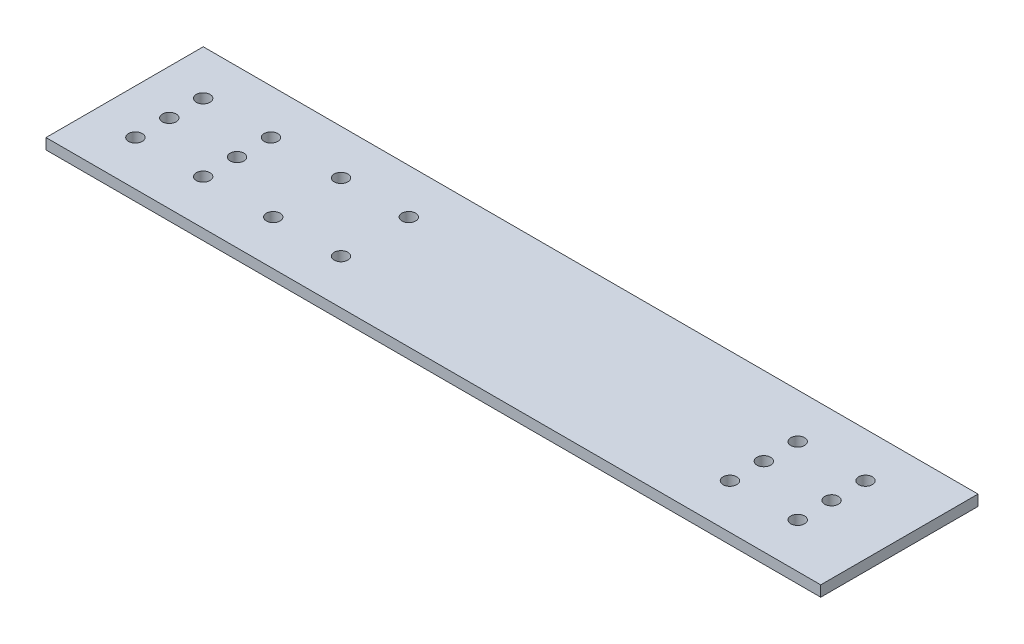
ISO-10303-21;
HEADER;
FILE_DESCRIPTION(('STEP AP214'),'2;1');
FILE_NAME('part.step','',(''),(''),'','','');
FILE_SCHEMA(('AUTOMOTIVE_DESIGN { 1 0 10303 214 1 1 1 1 }'));
ENDSEC;
DATA;
#1=APPLICATION_CONTEXT('core data for automotive mechanical design processes');
#2=APPLICATION_PROTOCOL_DEFINITION('international standard','automotive_design',2000,#1);
#3=PRODUCT_CONTEXT('',#1,'mechanical');
#4=PRODUCT('Part','Part','',(#3));
#5=PRODUCT_RELATED_PRODUCT_CATEGORY('part','',(#4));
#6=PRODUCT_DEFINITION_FORMATION('','',#4);
#7=PRODUCT_DEFINITION_CONTEXT('part definition',#1,'design');
#8=PRODUCT_DEFINITION('design','',#6,#7);
#9=PRODUCT_DEFINITION_SHAPE('','',#8);
#10=(LENGTH_UNIT() NAMED_UNIT(*) SI_UNIT(.MILLI.,.METRE.));
#11=(NAMED_UNIT(*) PLANE_ANGLE_UNIT() SI_UNIT($,.RADIAN.));
#12=(NAMED_UNIT(*) SI_UNIT($,.STERADIAN.) SOLID_ANGLE_UNIT());
#13=UNCERTAINTY_MEASURE_WITH_UNIT(LENGTH_MEASURE(1.E-05),#10,'distance_accuracy_value','');
#14=(GEOMETRIC_REPRESENTATION_CONTEXT(3) GLOBAL_UNCERTAINTY_ASSIGNED_CONTEXT((#13)) GLOBAL_UNIT_ASSIGNED_CONTEXT((#10,
#11,#12)) REPRESENTATION_CONTEXT('',''));
#15=CARTESIAN_POINT('',(0.,0.,0.));
#16=DIRECTION('',(0.,0.,1.));
#17=DIRECTION('',(1.,0.,0.));
#18=AXIS2_PLACEMENT_3D('',#15,#16,#17);
#19=CARTESIAN_POINT('',(0.,6.35,0.));
#20=DIRECTION('',(0.,-1.,0.));
#21=DIRECTION('',(0.,0.,-1.));
#22=AXIS2_PLACEMENT_3D('',#19,#20,#21);
#23=PLANE('',#22);
#24=DIRECTION('',(0.,0.,1.));
#25=VECTOR('',#24,1.);
#26=CARTESIAN_POINT('',(-46.35,6.35,-46.4));
#27=LINE('',#26,#25);
#28=CARTESIAN_POINT('',(-46.35,6.35,-46.4));
#29=VERTEX_POINT('',#28);
#30=CARTESIAN_POINT('',(-46.35,6.35,46.4));
#31=VERTEX_POINT('',#30);
#32=EDGE_CURVE('E85',#29,#31,#27,.T.);
#33=ORIENTED_EDGE('',*,*,#32,.T.);
#34=DIRECTION('',(1.,0.,0.));
#35=VECTOR('',#34,1.);
#36=CARTESIAN_POINT('',(410.85,6.35,46.3999999999999));
#37=LINE('',#36,#35);
#38=CARTESIAN_POINT('',(410.85,6.35,46.3999999999999));
#39=VERTEX_POINT('',#38);
#40=EDGE_CURVE('E80',#31,#39,#37,.T.);
#41=ORIENTED_EDGE('',*,*,#40,.T.);
#42=DIRECTION('',(0.,0.,-1.));
#43=VECTOR('',#42,1.);
#44=CARTESIAN_POINT('',(410.85,6.35,-46.4));
#45=LINE('',#44,#43);
#46=CARTESIAN_POINT('',(410.85,6.35,-46.4));
#47=VERTEX_POINT('',#46);
#48=EDGE_CURVE('E83',#39,#47,#45,.T.);
#49=ORIENTED_EDGE('',*,*,#48,.T.);
#50=DIRECTION('',(-1.,0.,0.));
#51=VECTOR('',#50,1.);
#52=CARTESIAN_POINT('',(-46.35,6.35,-46.4));
#53=LINE('',#52,#51);
#54=EDGE_CURVE('E50',#47,#29,#53,.T.);
#55=ORIENTED_EDGE('',*,*,#54,.T.);
#56=EDGE_LOOP('',(#33,#41,#49,#55));
#57=FACE_BOUND('',#56,.T.);
#58=CARTESIAN_POINT('',(-20.,6.35,-20.));
#59=DIRECTION('',(0.,1.,0.));
#60=DIRECTION('',(0.,0.,1.));
#61=AXIS2_PLACEMENT_3D('',#58,#59,#60);
#62=CIRCLE('',#61,4.05);
#63=CARTESIAN_POINT('',(-20.,6.35,-15.95));
#64=VERTEX_POINT('',#63);
#65=EDGE_CURVE('E100',#64,#64,#62,.T.);
#66=ORIENTED_EDGE('',*,*,#65,.F.);
#67=EDGE_LOOP('',(#66));
#68=FACE_BOUND('',#67,.T.);
#69=CARTESIAN_POINT('',(20.,6.35,-20.));
#70=DIRECTION('',(0.,1.,0.));
#71=DIRECTION('',(0.,0.,1.));
#72=AXIS2_PLACEMENT_3D('',#69,#70,#71);
#73=CIRCLE('',#72,4.05);
#74=CARTESIAN_POINT('',(20.,6.35,-15.95));
#75=VERTEX_POINT('',#74);
#76=EDGE_CURVE('E115',#75,#75,#73,.T.);
#77=ORIENTED_EDGE('',*,*,#76,.F.);
#78=EDGE_LOOP('',(#77));
#79=FACE_BOUND('',#78,.T.);
#80=CARTESIAN_POINT('',(20.,6.35,20.));
#81=DIRECTION('',(0.,1.,0.));
#82=DIRECTION('',(0.,0.,1.));
#83=AXIS2_PLACEMENT_3D('',#80,#81,#82);
#84=CIRCLE('',#83,4.05);
#85=CARTESIAN_POINT('',(20.,6.35,24.05));
#86=VERTEX_POINT('',#85);
#87=EDGE_CURVE('E121',#86,#86,#84,.T.);
#88=ORIENTED_EDGE('',*,*,#87,.F.);
#89=EDGE_LOOP('',(#88));
#90=FACE_BOUND('',#89,.T.);
#91=CARTESIAN_POINT('',(-20.,6.35,20.));
#92=DIRECTION('',(0.,1.,0.));
#93=DIRECTION('',(0.,0.,1.));
#94=AXIS2_PLACEMENT_3D('',#91,#92,#93);
#95=CIRCLE('',#94,4.05);
#96=CARTESIAN_POINT('',(-20.,6.35,24.05));
#97=VERTEX_POINT('',#96);
#98=EDGE_CURVE('E127',#97,#97,#95,.T.);
#99=ORIENTED_EDGE('',*,*,#98,.F.);
#100=EDGE_LOOP('',(#99));
#101=FACE_BOUND('',#100,.T.);
#102=CARTESIAN_POINT('',(-20.,6.35,0.));
#103=DIRECTION('',(0.,1.,0.));
#104=DIRECTION('',(0.,0.,1.));
#105=AXIS2_PLACEMENT_3D('',#102,#103,#104);
#106=CIRCLE('',#105,4.05);
#107=CARTESIAN_POINT('',(-20.,6.35,4.05));
#108=VERTEX_POINT('',#107);
#109=EDGE_CURVE('E133',#108,#108,#106,.T.);
#110=ORIENTED_EDGE('',*,*,#109,.F.);
#111=EDGE_LOOP('',(#110));
#112=FACE_BOUND('',#111,.T.);
#113=CARTESIAN_POINT('',(20.,6.35,0.));
#114=DIRECTION('',(0.,1.,0.));
#115=DIRECTION('',(0.,0.,1.));
#116=AXIS2_PLACEMENT_3D('',#113,#114,#115);
#117=CIRCLE('',#116,4.05);
#118=CARTESIAN_POINT('',(20.,6.35,4.05));
#119=VERTEX_POINT('',#118);
#120=EDGE_CURVE('E139',#119,#119,#117,.T.);
#121=ORIENTED_EDGE('',*,*,#120,.F.);
#122=EDGE_LOOP('',(#121));
#123=FACE_BOUND('',#122,.T.);
#124=CARTESIAN_POINT('',(330.85,6.35,-20.));
#125=DIRECTION('',(0.,1.,0.));
#126=DIRECTION('',(0.,0.,1.));
#127=AXIS2_PLACEMENT_3D('',#124,#125,#126);
#128=CIRCLE('',#127,4.05000000000002);
#129=CARTESIAN_POINT('',(330.85,6.35,-15.95));
#130=VERTEX_POINT('',#129);
#131=EDGE_CURVE('E145',#130,#130,#128,.T.);
#132=ORIENTED_EDGE('',*,*,#131,.F.);
#133=EDGE_LOOP('',(#132));
#134=FACE_BOUND('',#133,.T.);
#135=CARTESIAN_POINT('',(370.85,6.35,-20.));
#136=DIRECTION('',(0.,1.,0.));
#137=DIRECTION('',(0.,0.,1.));
#138=AXIS2_PLACEMENT_3D('',#135,#136,#137);
#139=CIRCLE('',#138,4.05000000000002);
#140=CARTESIAN_POINT('',(370.85,6.35,-15.95));
#141=VERTEX_POINT('',#140);
#142=EDGE_CURVE('E151',#141,#141,#139,.T.);
#143=ORIENTED_EDGE('',*,*,#142,.F.);
#144=EDGE_LOOP('',(#143));
#145=FACE_BOUND('',#144,.T.);
#146=CARTESIAN_POINT('',(370.85,6.35,20.));
#147=DIRECTION('',(0.,1.,0.));
#148=DIRECTION('',(0.,0.,1.));
#149=AXIS2_PLACEMENT_3D('',#146,#147,#148);
#150=CIRCLE('',#149,4.05000000000002);
#151=CARTESIAN_POINT('',(370.85,6.35,24.05));
#152=VERTEX_POINT('',#151);
#153=EDGE_CURVE('E157',#152,#152,#150,.T.);
#154=ORIENTED_EDGE('',*,*,#153,.F.);
#155=EDGE_LOOP('',(#154));
#156=FACE_BOUND('',#155,.T.);
#157=CARTESIAN_POINT('',(330.85,6.35,20.));
#158=DIRECTION('',(0.,1.,0.));
#159=DIRECTION('',(0.,0.,1.));
#160=AXIS2_PLACEMENT_3D('',#157,#158,#159);
#161=CIRCLE('',#160,4.05000000000002);
#162=CARTESIAN_POINT('',(330.85,6.35,24.05));
#163=VERTEX_POINT('',#162);
#164=EDGE_CURVE('E163',#163,#163,#161,.T.);
#165=ORIENTED_EDGE('',*,*,#164,.F.);
#166=EDGE_LOOP('',(#165));
#167=FACE_BOUND('',#166,.T.);
#168=CARTESIAN_POINT('',(61.35,6.35,-20.));
#169=DIRECTION('',(0.,1.,0.));
#170=DIRECTION('',(0.,0.,1.));
#171=AXIS2_PLACEMENT_3D('',#168,#169,#170);
#172=CIRCLE('',#171,4.05);
#173=CARTESIAN_POINT('',(61.35,6.35,-15.95));
#174=VERTEX_POINT('',#173);
#175=EDGE_CURVE('E169',#174,#174,#172,.T.);
#176=ORIENTED_EDGE('',*,*,#175,.F.);
#177=EDGE_LOOP('',(#176));
#178=FACE_BOUND('',#177,.T.);
#179=CARTESIAN_POINT('',(101.35,6.35,-20.));
#180=DIRECTION('',(0.,1.,0.));
#181=DIRECTION('',(0.,0.,1.));
#182=AXIS2_PLACEMENT_3D('',#179,#180,#181);
#183=CIRCLE('',#182,4.04999999999999);
#184=CARTESIAN_POINT('',(101.35,6.35,-15.95));
#185=VERTEX_POINT('',#184);
#186=EDGE_CURVE('E175',#185,#185,#183,.T.);
#187=ORIENTED_EDGE('',*,*,#186,.F.);
#188=EDGE_LOOP('',(#187));
#189=FACE_BOUND('',#188,.T.);
#190=CARTESIAN_POINT('',(330.85,6.35,0.));
#191=DIRECTION('',(0.,1.,0.));
#192=DIRECTION('',(0.,0.,1.));
#193=AXIS2_PLACEMENT_3D('',#190,#191,#192);
#194=CIRCLE('',#193,4.05000000000002);
#195=CARTESIAN_POINT('',(330.85,6.35,4.05000000000004));
#196=VERTEX_POINT('',#195);
#197=EDGE_CURVE('E181',#196,#196,#194,.T.);
#198=ORIENTED_EDGE('',*,*,#197,.F.);
#199=EDGE_LOOP('',(#198));
#200=FACE_BOUND('',#199,.T.);
#201=CARTESIAN_POINT('',(370.85,6.35,0.));
#202=DIRECTION('',(0.,1.,0.));
#203=DIRECTION('',(0.,0.,1.));
#204=AXIS2_PLACEMENT_3D('',#201,#202,#203);
#205=CIRCLE('',#204,4.05000000000002);
#206=CARTESIAN_POINT('',(370.85,6.35,4.05000000000004));
#207=VERTEX_POINT('',#206);
#208=EDGE_CURVE('E187',#207,#207,#205,.T.);
#209=ORIENTED_EDGE('',*,*,#208,.F.);
#210=EDGE_LOOP('',(#209));
#211=FACE_BOUND('',#210,.T.);
#212=CARTESIAN_POINT('',(101.35,6.35,20.));
#213=DIRECTION('',(0.,1.,0.));
#214=DIRECTION('',(0.,0.,1.));
#215=AXIS2_PLACEMENT_3D('',#212,#213,#214);
#216=CIRCLE('',#215,4.04999999999999);
#217=CARTESIAN_POINT('',(101.35,6.35,24.05));
#218=VERTEX_POINT('',#217);
#219=EDGE_CURVE('E193',#218,#218,#216,.T.);
#220=ORIENTED_EDGE('',*,*,#219,.F.);
#221=EDGE_LOOP('',(#220));
#222=FACE_BOUND('',#221,.T.);
#223=CARTESIAN_POINT('',(61.35,6.35,20.));
#224=DIRECTION('',(0.,1.,0.));
#225=DIRECTION('',(0.,0.,1.));
#226=AXIS2_PLACEMENT_3D('',#223,#224,#225);
#227=CIRCLE('',#226,4.05);
#228=CARTESIAN_POINT('',(61.35,6.35,24.05));
#229=VERTEX_POINT('',#228);
#230=EDGE_CURVE('E199',#229,#229,#227,.T.);
#231=ORIENTED_EDGE('',*,*,#230,.F.);
#232=EDGE_LOOP('',(#231));
#233=FACE_BOUND('',#232,.T.);
#234=ADVANCED_FACE('F33',(#57,#68,#79,#90,#101,#112,#123,#134,#145,#156,#167,#178,#189,#200,
#211,#222,#233),#23,.F.);
#235=CARTESIAN_POINT('',(0.,0.,0.));
#236=DIRECTION('',(0.,-1.,0.));
#237=DIRECTION('',(0.,0.,-1.));
#238=AXIS2_PLACEMENT_3D('',#235,#236,#237);
#239=PLANE('',#238);
#240=CARTESIAN_POINT('',(101.35,0.,20.));
#241=DIRECTION('',(0.,1.,0.));
#242=DIRECTION('',(0.,0.,1.));
#243=AXIS2_PLACEMENT_3D('',#240,#241,#242);
#244=CIRCLE('',#243,4.04999999999999);
#245=CARTESIAN_POINT('',(101.35,0.,24.05));
#246=VERTEX_POINT('',#245);
#247=EDGE_CURVE('E196',#246,#246,#244,.T.);
#248=ORIENTED_EDGE('',*,*,#247,.T.);
#249=EDGE_LOOP('',(#248));
#250=FACE_BOUND('',#249,.T.);
#251=CARTESIAN_POINT('',(330.85,0.,0.));
#252=DIRECTION('',(0.,1.,0.));
#253=DIRECTION('',(0.,0.,1.));
#254=AXIS2_PLACEMENT_3D('',#251,#252,#253);
#255=CIRCLE('',#254,4.05000000000002);
#256=CARTESIAN_POINT('',(330.85,0.,4.05000000000004));
#257=VERTEX_POINT('',#256);
#258=EDGE_CURVE('E184',#257,#257,#255,.T.);
#259=ORIENTED_EDGE('',*,*,#258,.T.);
#260=EDGE_LOOP('',(#259));
#261=FACE_BOUND('',#260,.T.);
#262=CARTESIAN_POINT('',(61.35,0.,-20.));
#263=DIRECTION('',(0.,1.,0.));
#264=DIRECTION('',(0.,0.,1.));
#265=AXIS2_PLACEMENT_3D('',#262,#263,#264);
#266=CIRCLE('',#265,4.05);
#267=CARTESIAN_POINT('',(61.35,0.,-15.95));
#268=VERTEX_POINT('',#267);
#269=EDGE_CURVE('E172',#268,#268,#266,.T.);
#270=ORIENTED_EDGE('',*,*,#269,.T.);
#271=EDGE_LOOP('',(#270));
#272=FACE_BOUND('',#271,.T.);
#273=CARTESIAN_POINT('',(370.85,0.,20.));
#274=DIRECTION('',(0.,1.,0.));
#275=DIRECTION('',(0.,0.,1.));
#276=AXIS2_PLACEMENT_3D('',#273,#274,#275);
#277=CIRCLE('',#276,4.05000000000002);
#278=CARTESIAN_POINT('',(370.85,0.,24.05));
#279=VERTEX_POINT('',#278);
#280=EDGE_CURVE('E160',#279,#279,#277,.T.);
#281=ORIENTED_EDGE('',*,*,#280,.T.);
#282=EDGE_LOOP('',(#281));
#283=FACE_BOUND('',#282,.T.);
#284=CARTESIAN_POINT('',(330.85,0.,-20.));
#285=DIRECTION('',(0.,1.,0.));
#286=DIRECTION('',(0.,0.,1.));
#287=AXIS2_PLACEMENT_3D('',#284,#285,#286);
#288=CIRCLE('',#287,4.05000000000002);
#289=CARTESIAN_POINT('',(330.85,0.,-15.95));
#290=VERTEX_POINT('',#289);
#291=EDGE_CURVE('E148',#290,#290,#288,.T.);
#292=ORIENTED_EDGE('',*,*,#291,.T.);
#293=EDGE_LOOP('',(#292));
#294=FACE_BOUND('',#293,.T.);
#295=CARTESIAN_POINT('',(-20.,0.,0.));
#296=DIRECTION('',(0.,1.,0.));
#297=DIRECTION('',(0.,0.,1.));
#298=AXIS2_PLACEMENT_3D('',#295,#296,#297);
#299=CIRCLE('',#298,4.05);
#300=CARTESIAN_POINT('',(-20.,0.,4.05));
#301=VERTEX_POINT('',#300);
#302=EDGE_CURVE('E136',#301,#301,#299,.T.);
#303=ORIENTED_EDGE('',*,*,#302,.T.);
#304=EDGE_LOOP('',(#303));
#305=FACE_BOUND('',#304,.T.);
#306=CARTESIAN_POINT('',(20.,0.,20.));
#307=DIRECTION('',(0.,1.,0.));
#308=DIRECTION('',(0.,0.,1.));
#309=AXIS2_PLACEMENT_3D('',#306,#307,#308);
#310=CIRCLE('',#309,4.05);
#311=CARTESIAN_POINT('',(20.,0.,24.05));
#312=VERTEX_POINT('',#311);
#313=EDGE_CURVE('E124',#312,#312,#310,.T.);
#314=ORIENTED_EDGE('',*,*,#313,.T.);
#315=EDGE_LOOP('',(#314));
#316=FACE_BOUND('',#315,.T.);
#317=CARTESIAN_POINT('',(-20.,0.,-20.));
#318=DIRECTION('',(0.,1.,0.));
#319=DIRECTION('',(0.,0.,1.));
#320=AXIS2_PLACEMENT_3D('',#317,#318,#319);
#321=CIRCLE('',#320,4.05);
#322=CARTESIAN_POINT('',(-20.,0.,-15.95));
#323=VERTEX_POINT('',#322);
#324=EDGE_CURVE('E112',#323,#323,#321,.T.);
#325=ORIENTED_EDGE('',*,*,#324,.T.);
#326=EDGE_LOOP('',(#325));
#327=FACE_BOUND('',#326,.T.);
#328=DIRECTION('',(0.,0.,1.));
#329=VECTOR('',#328,1.);
#330=CARTESIAN_POINT('',(-46.35,0.,-46.4));
#331=LINE('',#330,#329);
#332=CARTESIAN_POINT('',(-46.35,0.,-46.4));
#333=VERTEX_POINT('',#332);
#334=CARTESIAN_POINT('',(-46.35,0.,46.4));
#335=VERTEX_POINT('',#334);
#336=EDGE_CURVE('E97',#333,#335,#331,.T.);
#337=ORIENTED_EDGE('',*,*,#336,.F.);
#338=DIRECTION('',(-1.,0.,0.));
#339=VECTOR('',#338,1.);
#340=CARTESIAN_POINT('',(-46.35,0.,-46.4));
#341=LINE('',#340,#339);
#342=CARTESIAN_POINT('',(410.85,0.,-46.4));
#343=VERTEX_POINT('',#342);
#344=EDGE_CURVE('E73',#343,#333,#341,.T.);
#345=ORIENTED_EDGE('',*,*,#344,.F.);
#346=DIRECTION('',(0.,0.,-1.));
#347=VECTOR('',#346,1.);
#348=CARTESIAN_POINT('',(410.85,0.,-46.4));
#349=LINE('',#348,#347);
#350=CARTESIAN_POINT('',(410.85,0.,46.3999999999999));
#351=VERTEX_POINT('',#350);
#352=EDGE_CURVE('E67',#351,#343,#349,.T.);
#353=ORIENTED_EDGE('',*,*,#352,.F.);
#354=DIRECTION('',(1.,0.,0.));
#355=VECTOR('',#354,1.);
#356=CARTESIAN_POINT('',(410.85,0.,46.3999999999999));
#357=LINE('',#356,#355);
#358=EDGE_CURVE('E89',#335,#351,#357,.T.);
#359=ORIENTED_EDGE('',*,*,#358,.F.);
#360=EDGE_LOOP('',(#337,#345,#353,#359));
#361=FACE_BOUND('',#360,.T.);
#362=CARTESIAN_POINT('',(20.,0.,-20.));
#363=DIRECTION('',(0.,1.,0.));
#364=DIRECTION('',(0.,0.,1.));
#365=AXIS2_PLACEMENT_3D('',#362,#363,#364);
#366=CIRCLE('',#365,4.05);
#367=CARTESIAN_POINT('',(20.,0.,-15.95));
#368=VERTEX_POINT('',#367);
#369=EDGE_CURVE('E118',#368,#368,#366,.T.);
#370=ORIENTED_EDGE('',*,*,#369,.T.);
#371=EDGE_LOOP('',(#370));
#372=FACE_BOUND('',#371,.T.);
#373=CARTESIAN_POINT('',(-20.,0.,20.));
#374=DIRECTION('',(0.,1.,0.));
#375=DIRECTION('',(0.,0.,1.));
#376=AXIS2_PLACEMENT_3D('',#373,#374,#375);
#377=CIRCLE('',#376,4.05);
#378=CARTESIAN_POINT('',(-20.,0.,24.05));
#379=VERTEX_POINT('',#378);
#380=EDGE_CURVE('E130',#379,#379,#377,.T.);
#381=ORIENTED_EDGE('',*,*,#380,.T.);
#382=EDGE_LOOP('',(#381));
#383=FACE_BOUND('',#382,.T.);
#384=CARTESIAN_POINT('',(20.,0.,0.));
#385=DIRECTION('',(0.,1.,0.));
#386=DIRECTION('',(0.,0.,1.));
#387=AXIS2_PLACEMENT_3D('',#384,#385,#386);
#388=CIRCLE('',#387,4.05);
#389=CARTESIAN_POINT('',(20.,0.,4.05));
#390=VERTEX_POINT('',#389);
#391=EDGE_CURVE('E142',#390,#390,#388,.T.);
#392=ORIENTED_EDGE('',*,*,#391,.T.);
#393=EDGE_LOOP('',(#392));
#394=FACE_BOUND('',#393,.T.);
#395=CARTESIAN_POINT('',(370.85,0.,-20.));
#396=DIRECTION('',(0.,1.,0.));
#397=DIRECTION('',(0.,0.,1.));
#398=AXIS2_PLACEMENT_3D('',#395,#396,#397);
#399=CIRCLE('',#398,4.05000000000002);
#400=CARTESIAN_POINT('',(370.85,0.,-15.95));
#401=VERTEX_POINT('',#400);
#402=EDGE_CURVE('E154',#401,#401,#399,.T.);
#403=ORIENTED_EDGE('',*,*,#402,.T.);
#404=EDGE_LOOP('',(#403));
#405=FACE_BOUND('',#404,.T.);
#406=CARTESIAN_POINT('',(330.85,0.,20.));
#407=DIRECTION('',(0.,1.,0.));
#408=DIRECTION('',(0.,0.,1.));
#409=AXIS2_PLACEMENT_3D('',#406,#407,#408);
#410=CIRCLE('',#409,4.05000000000002);
#411=CARTESIAN_POINT('',(330.85,0.,24.05));
#412=VERTEX_POINT('',#411);
#413=EDGE_CURVE('E166',#412,#412,#410,.T.);
#414=ORIENTED_EDGE('',*,*,#413,.T.);
#415=EDGE_LOOP('',(#414));
#416=FACE_BOUND('',#415,.T.);
#417=CARTESIAN_POINT('',(101.35,0.,-20.));
#418=DIRECTION('',(0.,1.,0.));
#419=DIRECTION('',(0.,0.,1.));
#420=AXIS2_PLACEMENT_3D('',#417,#418,#419);
#421=CIRCLE('',#420,4.04999999999999);
#422=CARTESIAN_POINT('',(101.35,0.,-15.95));
#423=VERTEX_POINT('',#422);
#424=EDGE_CURVE('E178',#423,#423,#421,.T.);
#425=ORIENTED_EDGE('',*,*,#424,.T.);
#426=EDGE_LOOP('',(#425));
#427=FACE_BOUND('',#426,.T.);
#428=CARTESIAN_POINT('',(370.85,0.,0.));
#429=DIRECTION('',(0.,1.,0.));
#430=DIRECTION('',(0.,0.,1.));
#431=AXIS2_PLACEMENT_3D('',#428,#429,#430);
#432=CIRCLE('',#431,4.05000000000002);
#433=CARTESIAN_POINT('',(370.85,0.,4.05000000000004));
#434=VERTEX_POINT('',#433);
#435=EDGE_CURVE('E190',#434,#434,#432,.T.);
#436=ORIENTED_EDGE('',*,*,#435,.T.);
#437=EDGE_LOOP('',(#436));
#438=FACE_BOUND('',#437,.T.);
#439=CARTESIAN_POINT('',(61.35,0.,20.));
#440=DIRECTION('',(0.,1.,0.));
#441=DIRECTION('',(0.,0.,1.));
#442=AXIS2_PLACEMENT_3D('',#439,#440,#441);
#443=CIRCLE('',#442,4.05);
#444=CARTESIAN_POINT('',(61.35,0.,24.05));
#445=VERTEX_POINT('',#444);
#446=EDGE_CURVE('E202',#445,#445,#443,.T.);
#447=ORIENTED_EDGE('',*,*,#446,.T.);
#448=EDGE_LOOP('',(#447));
#449=FACE_BOUND('',#448,.T.);
#450=ADVANCED_FACE('F108',(#250,#261,#272,#283,#294,#305,#316,#327,#361,#372,#383,#394,#405,
#416,#427,#438,#449),#239,.T.);
#451=CARTESIAN_POINT('',(-46.35,6.35,-46.4));
#452=DIRECTION('',(1.,0.,0.));
#453=DIRECTION('',(0.,0.,-1.));
#454=AXIS2_PLACEMENT_3D('',#451,#452,#453);
#455=PLANE('',#454);
#456=ORIENTED_EDGE('',*,*,#336,.T.);
#457=DIRECTION('',(0.,-1.,0.));
#458=VECTOR('',#457,1.);
#459=CARTESIAN_POINT('',(-46.35,6.35,46.4));
#460=LINE('',#459,#458);
#461=EDGE_CURVE('E11',#31,#335,#460,.T.);
#462=ORIENTED_EDGE('',*,*,#461,.F.);
#463=ORIENTED_EDGE('',*,*,#32,.F.);
#464=DIRECTION('',(0.,-1.,0.));
#465=VECTOR('',#464,1.);
#466=CARTESIAN_POINT('',(-46.35,6.35,-46.4));
#467=LINE('',#466,#465);
#468=EDGE_CURVE('E93',#29,#333,#467,.T.);
#469=ORIENTED_EDGE('',*,*,#468,.T.);
#470=EDGE_LOOP('',(#456,#462,#463,#469));
#471=FACE_BOUND('',#470,.T.);
#472=ADVANCED_FACE('F35',(#471),#455,.F.);
#473=CARTESIAN_POINT('',(410.85,6.35,46.3999999999999));
#474=DIRECTION('',(0.,0.,-1.));
#475=DIRECTION('',(-1.,0.,0.));
#476=AXIS2_PLACEMENT_3D('',#473,#474,#475);
#477=PLANE('',#476);
#478=ORIENTED_EDGE('',*,*,#358,.T.);
#479=DIRECTION('',(0.,-1.,0.));
#480=VECTOR('',#479,1.);
#481=CARTESIAN_POINT('',(410.85,6.35,46.3999999999999));
#482=LINE('',#481,#480);
#483=EDGE_CURVE('E42',#39,#351,#482,.T.);
#484=ORIENTED_EDGE('',*,*,#483,.F.);
#485=ORIENTED_EDGE('',*,*,#40,.F.);
#486=ORIENTED_EDGE('',*,*,#461,.T.);
#487=EDGE_LOOP('',(#478,#484,#485,#486));
#488=FACE_BOUND('',#487,.T.);
#489=ADVANCED_FACE('F88',(#488),#477,.F.);
#490=CARTESIAN_POINT('',(410.85,6.35,-46.4));
#491=DIRECTION('',(-1.,0.,0.));
#492=DIRECTION('',(0.,0.,1.));
#493=AXIS2_PLACEMENT_3D('',#490,#491,#492);
#494=PLANE('',#493);
#495=ORIENTED_EDGE('',*,*,#352,.T.);
#496=DIRECTION('',(0.,-1.,0.));
#497=VECTOR('',#496,1.);
#498=CARTESIAN_POINT('',(410.85,6.35,-46.4));
#499=LINE('',#498,#497);
#500=EDGE_CURVE('E90',#47,#343,#499,.T.);
#501=ORIENTED_EDGE('',*,*,#500,.F.);
#502=ORIENTED_EDGE('',*,*,#48,.F.);
#503=ORIENTED_EDGE('',*,*,#483,.T.);
#504=EDGE_LOOP('',(#495,#501,#502,#503));
#505=FACE_BOUND('',#504,.T.);
#506=ADVANCED_FACE('F91',(#505),#494,.F.);
#507=CARTESIAN_POINT('',(-46.35,6.35,-46.4));
#508=DIRECTION('',(0.,0.,1.));
#509=DIRECTION('',(1.,0.,0.));
#510=AXIS2_PLACEMENT_3D('',#507,#508,#509);
#511=PLANE('',#510);
#512=ORIENTED_EDGE('',*,*,#344,.T.);
#513=ORIENTED_EDGE('',*,*,#468,.F.);
#514=ORIENTED_EDGE('',*,*,#54,.F.);
#515=ORIENTED_EDGE('',*,*,#500,.T.);
#516=EDGE_LOOP('',(#512,#513,#514,#515));
#517=FACE_BOUND('',#516,.T.);
#518=ADVANCED_FACE('F105',(#517),#511,.F.);
#519=CARTESIAN_POINT('',(-20.,6.35,-20.));
#520=DIRECTION('',(0.,-1.,0.));
#521=DIRECTION('',(0.,0.,-1.));
#522=AXIS2_PLACEMENT_3D('',#519,#520,#521);
#523=CYLINDRICAL_SURFACE('',#522,4.05);
#524=ORIENTED_EDGE('',*,*,#65,.T.);
#525=EDGE_LOOP('',(#524));
#526=FACE_BOUND('',#525,.T.);
#527=ORIENTED_EDGE('',*,*,#324,.F.);
#528=EDGE_LOOP('',(#527));
#529=FACE_BOUND('',#528,.T.);
#530=ADVANCED_FACE('F219',(#526,#529),#523,.F.);
#531=CARTESIAN_POINT('',(20.,6.35,-20.));
#532=DIRECTION('',(0.,-1.,0.));
#533=DIRECTION('',(0.,0.,-1.));
#534=AXIS2_PLACEMENT_3D('',#531,#532,#533);
#535=CYLINDRICAL_SURFACE('',#534,4.05);
#536=ORIENTED_EDGE('',*,*,#76,.T.);
#537=EDGE_LOOP('',(#536));
#538=FACE_BOUND('',#537,.T.);
#539=ORIENTED_EDGE('',*,*,#369,.F.);
#540=EDGE_LOOP('',(#539));
#541=FACE_BOUND('',#540,.T.);
#542=ADVANCED_FACE('F265',(#538,#541),#535,.F.);
#543=CARTESIAN_POINT('',(20.,6.35,20.));
#544=DIRECTION('',(0.,-1.,0.));
#545=DIRECTION('',(0.,0.,-1.));
#546=AXIS2_PLACEMENT_3D('',#543,#544,#545);
#547=CYLINDRICAL_SURFACE('',#546,4.05);
#548=ORIENTED_EDGE('',*,*,#87,.T.);
#549=EDGE_LOOP('',(#548));
#550=FACE_BOUND('',#549,.T.);
#551=ORIENTED_EDGE('',*,*,#313,.F.);
#552=EDGE_LOOP('',(#551));
#553=FACE_BOUND('',#552,.T.);
#554=ADVANCED_FACE('F273',(#550,#553),#547,.F.);
#555=CARTESIAN_POINT('',(-20.,6.35,20.));
#556=DIRECTION('',(0.,-1.,0.));
#557=DIRECTION('',(0.,0.,-1.));
#558=AXIS2_PLACEMENT_3D('',#555,#556,#557);
#559=CYLINDRICAL_SURFACE('',#558,4.05);
#560=ORIENTED_EDGE('',*,*,#98,.T.);
#561=EDGE_LOOP('',(#560));
#562=FACE_BOUND('',#561,.T.);
#563=ORIENTED_EDGE('',*,*,#380,.F.);
#564=EDGE_LOOP('',(#563));
#565=FACE_BOUND('',#564,.T.);
#566=ADVANCED_FACE('F281',(#562,#565),#559,.F.);
#567=CARTESIAN_POINT('',(-20.,6.35,0.));
#568=DIRECTION('',(0.,-1.,0.));
#569=DIRECTION('',(0.,0.,-1.));
#570=AXIS2_PLACEMENT_3D('',#567,#568,#569);
#571=CYLINDRICAL_SURFACE('',#570,4.05);
#572=ORIENTED_EDGE('',*,*,#109,.T.);
#573=EDGE_LOOP('',(#572));
#574=FACE_BOUND('',#573,.T.);
#575=ORIENTED_EDGE('',*,*,#302,.F.);
#576=EDGE_LOOP('',(#575));
#577=FACE_BOUND('',#576,.T.);
#578=ADVANCED_FACE('F290',(#574,#577),#571,.F.);
#579=CARTESIAN_POINT('',(20.,6.35,0.));
#580=DIRECTION('',(0.,-1.,0.));
#581=DIRECTION('',(0.,0.,-1.));
#582=AXIS2_PLACEMENT_3D('',#579,#580,#581);
#583=CYLINDRICAL_SURFACE('',#582,4.05);
#584=ORIENTED_EDGE('',*,*,#120,.T.);
#585=EDGE_LOOP('',(#584));
#586=FACE_BOUND('',#585,.T.);
#587=ORIENTED_EDGE('',*,*,#391,.F.);
#588=EDGE_LOOP('',(#587));
#589=FACE_BOUND('',#588,.T.);
#590=ADVANCED_FACE('F299',(#586,#589),#583,.F.);
#591=CARTESIAN_POINT('',(330.85,6.35,-20.));
#592=DIRECTION('',(0.,-1.,0.));
#593=DIRECTION('',(0.,0.,-1.));
#594=AXIS2_PLACEMENT_3D('',#591,#592,#593);
#595=CYLINDRICAL_SURFACE('',#594,4.05000000000002);
#596=ORIENTED_EDGE('',*,*,#131,.T.);
#597=EDGE_LOOP('',(#596));
#598=FACE_BOUND('',#597,.T.);
#599=ORIENTED_EDGE('',*,*,#291,.F.);
#600=EDGE_LOOP('',(#599));
#601=FACE_BOUND('',#600,.T.);
#602=ADVANCED_FACE('F308',(#598,#601),#595,.F.);
#603=CARTESIAN_POINT('',(370.85,6.35,-20.));
#604=DIRECTION('',(0.,-1.,0.));
#605=DIRECTION('',(0.,0.,-1.));
#606=AXIS2_PLACEMENT_3D('',#603,#604,#605);
#607=CYLINDRICAL_SURFACE('',#606,4.05000000000002);
#608=ORIENTED_EDGE('',*,*,#142,.T.);
#609=EDGE_LOOP('',(#608));
#610=FACE_BOUND('',#609,.T.);
#611=ORIENTED_EDGE('',*,*,#402,.F.);
#612=EDGE_LOOP('',(#611));
#613=FACE_BOUND('',#612,.T.);
#614=ADVANCED_FACE('F317',(#610,#613),#607,.F.);
#615=CARTESIAN_POINT('',(370.85,6.35,20.));
#616=DIRECTION('',(0.,-1.,0.));
#617=DIRECTION('',(0.,0.,-1.));
#618=AXIS2_PLACEMENT_3D('',#615,#616,#617);
#619=CYLINDRICAL_SURFACE('',#618,4.05000000000002);
#620=ORIENTED_EDGE('',*,*,#153,.T.);
#621=EDGE_LOOP('',(#620));
#622=FACE_BOUND('',#621,.T.);
#623=ORIENTED_EDGE('',*,*,#280,.F.);
#624=EDGE_LOOP('',(#623));
#625=FACE_BOUND('',#624,.T.);
#626=ADVANCED_FACE('F326',(#622,#625),#619,.F.);
#627=CARTESIAN_POINT('',(330.85,6.35,20.));
#628=DIRECTION('',(0.,-1.,0.));
#629=DIRECTION('',(0.,0.,-1.));
#630=AXIS2_PLACEMENT_3D('',#627,#628,#629);
#631=CYLINDRICAL_SURFACE('',#630,4.05000000000002);
#632=ORIENTED_EDGE('',*,*,#164,.T.);
#633=EDGE_LOOP('',(#632));
#634=FACE_BOUND('',#633,.T.);
#635=ORIENTED_EDGE('',*,*,#413,.F.);
#636=EDGE_LOOP('',(#635));
#637=FACE_BOUND('',#636,.T.);
#638=ADVANCED_FACE('F335',(#634,#637),#631,.F.);
#639=CARTESIAN_POINT('',(61.35,6.35,-20.));
#640=DIRECTION('',(0.,-1.,0.));
#641=DIRECTION('',(0.,0.,-1.));
#642=AXIS2_PLACEMENT_3D('',#639,#640,#641);
#643=CYLINDRICAL_SURFACE('',#642,4.05);
#644=ORIENTED_EDGE('',*,*,#175,.T.);
#645=EDGE_LOOP('',(#644));
#646=FACE_BOUND('',#645,.T.);
#647=ORIENTED_EDGE('',*,*,#269,.F.);
#648=EDGE_LOOP('',(#647));
#649=FACE_BOUND('',#648,.T.);
#650=ADVANCED_FACE('F344',(#646,#649),#643,.F.);
#651=CARTESIAN_POINT('',(101.35,6.35,-20.));
#652=DIRECTION('',(0.,-1.,0.));
#653=DIRECTION('',(0.,0.,-1.));
#654=AXIS2_PLACEMENT_3D('',#651,#652,#653);
#655=CYLINDRICAL_SURFACE('',#654,4.04999999999999);
#656=ORIENTED_EDGE('',*,*,#186,.T.);
#657=EDGE_LOOP('',(#656));
#658=FACE_BOUND('',#657,.T.);
#659=ORIENTED_EDGE('',*,*,#424,.F.);
#660=EDGE_LOOP('',(#659));
#661=FACE_BOUND('',#660,.T.);
#662=ADVANCED_FACE('F353',(#658,#661),#655,.F.);
#663=CARTESIAN_POINT('',(330.85,6.35,0.));
#664=DIRECTION('',(0.,-1.,0.));
#665=DIRECTION('',(0.,0.,-1.));
#666=AXIS2_PLACEMENT_3D('',#663,#664,#665);
#667=CYLINDRICAL_SURFACE('',#666,4.05000000000002);
#668=ORIENTED_EDGE('',*,*,#197,.T.);
#669=EDGE_LOOP('',(#668));
#670=FACE_BOUND('',#669,.T.);
#671=ORIENTED_EDGE('',*,*,#258,.F.);
#672=EDGE_LOOP('',(#671));
#673=FACE_BOUND('',#672,.T.);
#674=ADVANCED_FACE('F362',(#670,#673),#667,.F.);
#675=CARTESIAN_POINT('',(370.85,6.35,0.));
#676=DIRECTION('',(0.,-1.,0.));
#677=DIRECTION('',(0.,0.,-1.));
#678=AXIS2_PLACEMENT_3D('',#675,#676,#677);
#679=CYLINDRICAL_SURFACE('',#678,4.05000000000002);
#680=ORIENTED_EDGE('',*,*,#208,.T.);
#681=EDGE_LOOP('',(#680));
#682=FACE_BOUND('',#681,.T.);
#683=ORIENTED_EDGE('',*,*,#435,.F.);
#684=EDGE_LOOP('',(#683));
#685=FACE_BOUND('',#684,.T.);
#686=ADVANCED_FACE('F371',(#682,#685),#679,.F.);
#687=CARTESIAN_POINT('',(101.35,6.35,20.));
#688=DIRECTION('',(0.,-1.,0.));
#689=DIRECTION('',(0.,0.,-1.));
#690=AXIS2_PLACEMENT_3D('',#687,#688,#689);
#691=CYLINDRICAL_SURFACE('',#690,4.04999999999999);
#692=ORIENTED_EDGE('',*,*,#219,.T.);
#693=EDGE_LOOP('',(#692));
#694=FACE_BOUND('',#693,.T.);
#695=ORIENTED_EDGE('',*,*,#247,.F.);
#696=EDGE_LOOP('',(#695));
#697=FACE_BOUND('',#696,.T.);
#698=ADVANCED_FACE('F380',(#694,#697),#691,.F.);
#699=CARTESIAN_POINT('',(61.35,6.35,20.));
#700=DIRECTION('',(0.,-1.,0.));
#701=DIRECTION('',(0.,0.,-1.));
#702=AXIS2_PLACEMENT_3D('',#699,#700,#701);
#703=CYLINDRICAL_SURFACE('',#702,4.05);
#704=ORIENTED_EDGE('',*,*,#230,.T.);
#705=EDGE_LOOP('',(#704));
#706=FACE_BOUND('',#705,.T.);
#707=ORIENTED_EDGE('',*,*,#446,.F.);
#708=EDGE_LOOP('',(#707));
#709=FACE_BOUND('',#708,.T.);
#710=ADVANCED_FACE('F208',(#706,#709),#703,.F.);
#711=CLOSED_SHELL('',(#234,#450,#472,#489,#506,#518,#530,#542,#554,#566,#578,#590,#602,#614,
#626,#638,#650,#662,#674,#686,#698,#710));
#712=MANIFOLD_SOLID_BREP('B2',#711);
#713=ADVANCED_BREP_SHAPE_REPRESENTATION('',(#18,#712),#14);
#714=SHAPE_DEFINITION_REPRESENTATION(#9,#713);
ENDSEC;
END-ISO-10303-21;
